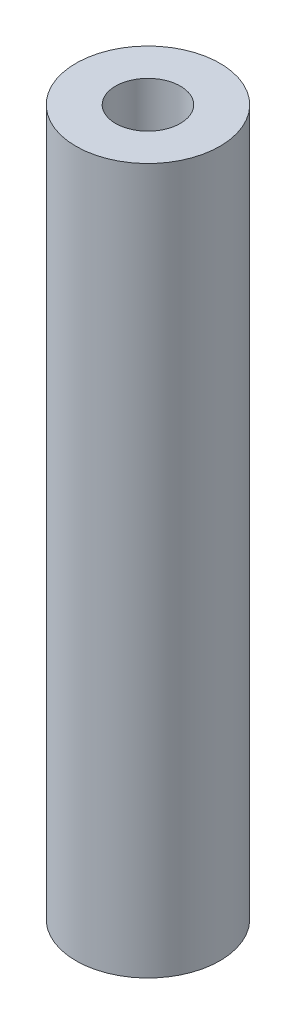
ISO-10303-21;
HEADER;
FILE_DESCRIPTION(('STEP AP214'),'2;1');
FILE_NAME('part.step','',(''),(''),'','','');
FILE_SCHEMA(('AUTOMOTIVE_DESIGN { 1 0 10303 214 1 1 1 1 }'));
ENDSEC;
DATA;
#1=APPLICATION_CONTEXT('core data for automotive mechanical design processes');
#2=APPLICATION_PROTOCOL_DEFINITION('international standard','automotive_design',2000,#1);
#3=PRODUCT_CONTEXT('',#1,'mechanical');
#4=PRODUCT('Part','Part','',(#3));
#5=PRODUCT_RELATED_PRODUCT_CATEGORY('part','',(#4));
#6=PRODUCT_DEFINITION_FORMATION('','',#4);
#7=PRODUCT_DEFINITION_CONTEXT('part definition',#1,'design');
#8=PRODUCT_DEFINITION('design','',#6,#7);
#9=PRODUCT_DEFINITION_SHAPE('','',#8);
#10=(LENGTH_UNIT() NAMED_UNIT(*) SI_UNIT(.MILLI.,.METRE.));
#11=(NAMED_UNIT(*) PLANE_ANGLE_UNIT() SI_UNIT($,.RADIAN.));
#12=(NAMED_UNIT(*) SI_UNIT($,.STERADIAN.) SOLID_ANGLE_UNIT());
#13=UNCERTAINTY_MEASURE_WITH_UNIT(LENGTH_MEASURE(1.E-05),#10,'distance_accuracy_value','');
#14=(GEOMETRIC_REPRESENTATION_CONTEXT(3) GLOBAL_UNCERTAINTY_ASSIGNED_CONTEXT((#13)) GLOBAL_UNIT_ASSIGNED_CONTEXT((#10,
#11,#12)) REPRESENTATION_CONTEXT('',''));
#15=CARTESIAN_POINT('',(0.,0.,0.));
#16=DIRECTION('',(0.,0.,1.));
#17=DIRECTION('',(1.,0.,0.));
#18=AXIS2_PLACEMENT_3D('',#15,#16,#17);
#19=CARTESIAN_POINT('',(0.,24.5,0.));
#20=DIRECTION('',(0.,-1.,0.));
#21=DIRECTION('',(0.,0.,-1.));
#22=AXIS2_PLACEMENT_3D('',#19,#20,#21);
#23=CYLINDRICAL_SURFACE('',#22,5.);
#24=CARTESIAN_POINT('',(0.,24.5,0.));
#25=DIRECTION('',(0.,1.,0.));
#26=DIRECTION('',(0.,0.,1.));
#27=AXIS2_PLACEMENT_3D('',#24,#25,#26);
#28=CIRCLE('',#27,5.);
#29=CARTESIAN_POINT('',(0.,24.5,5.));
#30=VERTEX_POINT('',#29);
#31=EDGE_CURVE('E10',#30,#30,#28,.T.);
#32=ORIENTED_EDGE('',*,*,#31,.F.);
#33=EDGE_LOOP('',(#32));
#34=FACE_BOUND('',#33,.T.);
#35=CARTESIAN_POINT('',(0.,-24.5,0.));
#36=DIRECTION('',(0.,1.,0.));
#37=DIRECTION('',(0.,0.,1.));
#38=AXIS2_PLACEMENT_3D('',#35,#36,#37);
#39=CIRCLE('',#38,5.);
#40=CARTESIAN_POINT('',(0.,-24.5,5.));
#41=VERTEX_POINT('',#40);
#42=EDGE_CURVE('E36',#41,#41,#39,.T.);
#43=ORIENTED_EDGE('',*,*,#42,.T.);
#44=EDGE_LOOP('',(#43));
#45=FACE_BOUND('',#44,.T.);
#46=ADVANCED_FACE('F33',(#34,#45),#23,.T.);
#47=CARTESIAN_POINT('',(0.,24.5,0.));
#48=DIRECTION('',(0.,1.,0.));
#49=DIRECTION('',(0.,0.,1.));
#50=AXIS2_PLACEMENT_3D('',#47,#48,#49);
#51=PLANE('',#50);
#52=CARTESIAN_POINT('',(0.,24.5,0.));
#53=DIRECTION('',(0.,1.,0.));
#54=DIRECTION('',(0.,0.,1.));
#55=AXIS2_PLACEMENT_3D('',#52,#53,#54);
#56=CIRCLE('',#55,2.24999999999999);
#57=CARTESIAN_POINT('',(0.,24.5,2.24999999999999));
#58=VERTEX_POINT('',#57);
#59=EDGE_CURVE('E47',#58,#58,#56,.T.);
#60=ORIENTED_EDGE('',*,*,#59,.F.);
#61=EDGE_LOOP('',(#60));
#62=FACE_BOUND('',#61,.T.);
#63=ORIENTED_EDGE('',*,*,#31,.T.);
#64=EDGE_LOOP('',(#63));
#65=FACE_BOUND('',#64,.T.);
#66=ADVANCED_FACE('F53',(#62,#65),#51,.T.);
#67=CARTESIAN_POINT('',(0.,-24.5,0.));
#68=DIRECTION('',(0.,1.,0.));
#69=DIRECTION('',(0.,0.,1.));
#70=AXIS2_PLACEMENT_3D('',#67,#68,#69);
#71=PLANE('',#70);
#72=CARTESIAN_POINT('',(0.,-24.5,0.));
#73=DIRECTION('',(0.,1.,0.));
#74=DIRECTION('',(0.,0.,1.));
#75=AXIS2_PLACEMENT_3D('',#72,#73,#74);
#76=CIRCLE('',#75,2.24999999999999);
#77=CARTESIAN_POINT('',(0.,-24.5,2.24999999999999));
#78=VERTEX_POINT('',#77);
#79=EDGE_CURVE('E43',#78,#78,#76,.T.);
#80=ORIENTED_EDGE('',*,*,#79,.T.);
#81=EDGE_LOOP('',(#80));
#82=FACE_BOUND('',#81,.T.);
#83=ORIENTED_EDGE('',*,*,#42,.F.);
#84=EDGE_LOOP('',(#83));
#85=FACE_BOUND('',#84,.T.);
#86=ADVANCED_FACE('F55',(#82,#85),#71,.F.);
#87=CARTESIAN_POINT('',(0.,24.5,0.));
#88=DIRECTION('',(0.,1.,0.));
#89=DIRECTION('',(0.,0.,1.));
#90=AXIS2_PLACEMENT_3D('',#87,#88,#89);
#91=CYLINDRICAL_SURFACE('',#90,2.24999999999999);
#92=ORIENTED_EDGE('',*,*,#79,.F.);
#93=EDGE_LOOP('',(#92));
#94=FACE_BOUND('',#93,.T.);
#95=ORIENTED_EDGE('',*,*,#59,.T.);
#96=EDGE_LOOP('',(#95));
#97=FACE_BOUND('',#96,.T.);
#98=ADVANCED_FACE('F51',(#94,#97),#91,.F.);
#99=CLOSED_SHELL('',(#46,#66,#86,#98));
#100=MANIFOLD_SOLID_BREP('B2',#99);
#101=ADVANCED_BREP_SHAPE_REPRESENTATION('',(#18,#100),#14);
#102=SHAPE_DEFINITION_REPRESENTATION(#9,#101);
ENDSEC;
END-ISO-10303-21;
